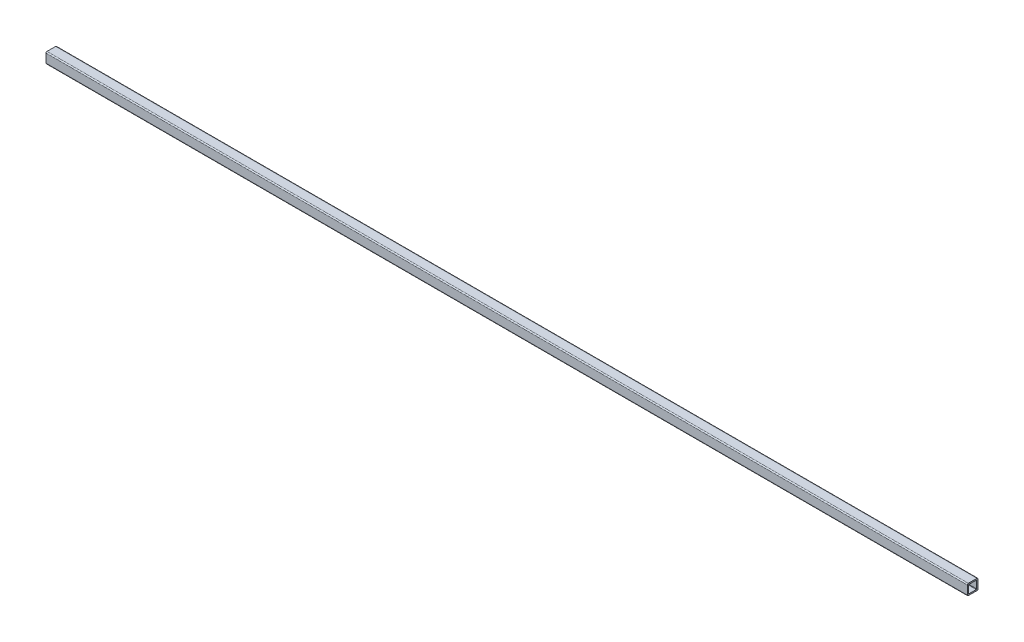
ISO-10303-21;
HEADER;
FILE_DESCRIPTION(('STEP AP214'),'2;1');
FILE_NAME('part.step','',(''),(''),'','','');
FILE_SCHEMA(('AUTOMOTIVE_DESIGN { 1 0 10303 214 1 1 1 1 }'));
ENDSEC;
DATA;
#1=APPLICATION_CONTEXT('core data for automotive mechanical design processes');
#2=APPLICATION_PROTOCOL_DEFINITION('international standard','automotive_design',2000,#1);
#3=PRODUCT_CONTEXT('',#1,'mechanical');
#4=PRODUCT('Part','Part','',(#3));
#5=PRODUCT_RELATED_PRODUCT_CATEGORY('part','',(#4));
#6=PRODUCT_DEFINITION_FORMATION('','',#4);
#7=PRODUCT_DEFINITION_CONTEXT('part definition',#1,'design');
#8=PRODUCT_DEFINITION('design','',#6,#7);
#9=PRODUCT_DEFINITION_SHAPE('','',#8);
#10=(LENGTH_UNIT() NAMED_UNIT(*) SI_UNIT(.MILLI.,.METRE.));
#11=(NAMED_UNIT(*) PLANE_ANGLE_UNIT() SI_UNIT($,.RADIAN.));
#12=(NAMED_UNIT(*) SI_UNIT($,.STERADIAN.) SOLID_ANGLE_UNIT());
#13=UNCERTAINTY_MEASURE_WITH_UNIT(LENGTH_MEASURE(1.E-05),#10,'distance_accuracy_value','');
#14=(GEOMETRIC_REPRESENTATION_CONTEXT(3) GLOBAL_UNCERTAINTY_ASSIGNED_CONTEXT((#13)) GLOBAL_UNIT_ASSIGNED_CONTEXT((#10,
#11,#12)) REPRESENTATION_CONTEXT('',''));
#15=CARTESIAN_POINT('',(0.,0.,0.));
#16=DIRECTION('',(0.,0.,1.));
#17=DIRECTION('',(1.,0.,0.));
#18=AXIS2_PLACEMENT_3D('',#15,#16,#17);
#19=CARTESIAN_POINT('',(-2185.66,12.7,-12.7));
#20=DIRECTION('',(0.,0.,-1.));
#21=DIRECTION('',(0.,1.,0.));
#22=AXIS2_PLACEMENT_3D('',#19,#20,#21);
#23=PLANE('',#22);
#24=DIRECTION('',(0.,1.,0.));
#25=VECTOR('',#24,1.);
#26=CARTESIAN_POINT('',(0.,12.7,-12.7));
#27=LINE('',#26,#25);
#28=CARTESIAN_POINT('',(0.,-10.2,-12.7));
#29=VERTEX_POINT('',#28);
#30=CARTESIAN_POINT('',(0.,10.2,-12.7));
#31=VERTEX_POINT('',#30);
#32=EDGE_CURVE('E258',#29,#31,#27,.T.);
#33=ORIENTED_EDGE('',*,*,#32,.F.);
#34=DIRECTION('',(1.,0.,0.));
#35=VECTOR('',#34,1.);
#36=CARTESIAN_POINT('',(-2185.66,-10.2,-12.7));
#37=LINE('',#36,#35);
#38=CARTESIAN_POINT('',(-2185.66,-10.2,-12.7));
#39=VERTEX_POINT('',#38);
#40=EDGE_CURVE('E187',#29,#39,#37,.F.);
#41=ORIENTED_EDGE('',*,*,#40,.T.);
#42=DIRECTION('',(0.,1.,0.));
#43=VECTOR('',#42,1.);
#44=CARTESIAN_POINT('',(-2185.66,12.7,-12.7));
#45=LINE('',#44,#43);
#46=CARTESIAN_POINT('',(-2185.66,10.2,-12.7));
#47=VERTEX_POINT('',#46);
#48=EDGE_CURVE('E168',#39,#47,#45,.T.);
#49=ORIENTED_EDGE('',*,*,#48,.T.);
#50=DIRECTION('',(1.,0.,0.));
#51=VECTOR('',#50,1.);
#52=CARTESIAN_POINT('',(-2185.66,10.2,-12.7));
#53=LINE('',#52,#51);
#54=EDGE_CURVE('E184',#47,#31,#53,.T.);
#55=ORIENTED_EDGE('',*,*,#54,.T.);
#56=EDGE_LOOP('',(#33,#41,#49,#55));
#57=FACE_BOUND('',#56,.T.);
#58=ADVANCED_FACE('F33',(#57),#23,.T.);
#59=CARTESIAN_POINT('',(-2185.66,-12.7,12.7));
#60=DIRECTION('',(0.,-1.,0.));
#61=DIRECTION('',(0.,0.,-1.));
#62=AXIS2_PLACEMENT_3D('',#59,#60,#61);
#63=PLANE('',#62);
#64=DIRECTION('',(0.,0.,-1.));
#65=VECTOR('',#64,1.);
#66=CARTESIAN_POINT('',(-2185.66,-12.7,12.7));
#67=LINE('',#66,#65);
#68=CARTESIAN_POINT('',(-2185.66,-12.7,10.2));
#69=VERTEX_POINT('',#68);
#70=CARTESIAN_POINT('',(-2185.66,-12.7,-10.2));
#71=VERTEX_POINT('',#70);
#72=EDGE_CURVE('E173',#69,#71,#67,.T.);
#73=ORIENTED_EDGE('',*,*,#72,.T.);
#74=DIRECTION('',(1.,0.,0.));
#75=VECTOR('',#74,1.);
#76=CARTESIAN_POINT('',(-2185.66,-12.7,-10.2));
#77=LINE('',#76,#75);
#78=CARTESIAN_POINT('',(0.,-12.7,-10.2));
#79=VERTEX_POINT('',#78);
#80=EDGE_CURVE('E167',#71,#79,#77,.T.);
#81=ORIENTED_EDGE('',*,*,#80,.T.);
#82=DIRECTION('',(0.,0.,-1.));
#83=VECTOR('',#82,1.);
#84=CARTESIAN_POINT('',(0.,-12.7,12.7));
#85=LINE('',#84,#83);
#86=CARTESIAN_POINT('',(0.,-12.7,10.2));
#87=VERTEX_POINT('',#86);
#88=EDGE_CURVE('E150',#87,#79,#85,.T.);
#89=ORIENTED_EDGE('',*,*,#88,.F.);
#90=DIRECTION('',(1.,0.,0.));
#91=VECTOR('',#90,1.);
#92=CARTESIAN_POINT('',(-2185.66,-12.7,10.2));
#93=LINE('',#92,#91);
#94=EDGE_CURVE('E164',#87,#69,#93,.F.);
#95=ORIENTED_EDGE('',*,*,#94,.T.);
#96=EDGE_LOOP('',(#73,#81,#89,#95));
#97=FACE_BOUND('',#96,.T.);
#98=ADVANCED_FACE('F163',(#97),#63,.T.);
#99=CARTESIAN_POINT('',(-2185.66,12.7,12.7));
#100=DIRECTION('',(0.,0.,1.));
#101=DIRECTION('',(0.,-1.,0.));
#102=AXIS2_PLACEMENT_3D('',#99,#100,#101);
#103=PLANE('',#102);
#104=DIRECTION('',(0.,-1.,0.));
#105=VECTOR('',#104,1.);
#106=CARTESIAN_POINT('',(-2185.66,12.7,12.7));
#107=LINE('',#106,#105);
#108=CARTESIAN_POINT('',(-2185.66,10.2,12.7));
#109=VERTEX_POINT('',#108);
#110=CARTESIAN_POINT('',(-2185.66,-10.2,12.7));
#111=VERTEX_POINT('',#110);
#112=EDGE_CURVE('E177',#109,#111,#107,.T.);
#113=ORIENTED_EDGE('',*,*,#112,.T.);
#114=DIRECTION('',(1.,0.,0.));
#115=VECTOR('',#114,1.);
#116=CARTESIAN_POINT('',(-2185.66,-10.2,12.7));
#117=LINE('',#116,#115);
#118=CARTESIAN_POINT('',(0.,-10.2,12.7));
#119=VERTEX_POINT('',#118);
#120=EDGE_CURVE('E198',#111,#119,#117,.T.);
#121=ORIENTED_EDGE('',*,*,#120,.T.);
#122=DIRECTION('',(0.,-1.,0.));
#123=VECTOR('',#122,1.);
#124=CARTESIAN_POINT('',(0.,12.7,12.7));
#125=LINE('',#124,#123);
#126=CARTESIAN_POINT('',(0.,10.2,12.7));
#127=VERTEX_POINT('',#126);
#128=EDGE_CURVE('E152',#127,#119,#125,.T.);
#129=ORIENTED_EDGE('',*,*,#128,.F.);
#130=DIRECTION('',(1.,0.,0.));
#131=VECTOR('',#130,1.);
#132=CARTESIAN_POINT('',(-2185.66,10.2,12.7));
#133=LINE('',#132,#131);
#134=EDGE_CURVE('E196',#127,#109,#133,.F.);
#135=ORIENTED_EDGE('',*,*,#134,.T.);
#136=EDGE_LOOP('',(#113,#121,#129,#135));
#137=FACE_BOUND('',#136,.T.);
#138=ADVANCED_FACE('F302',(#137),#103,.T.);
#139=CARTESIAN_POINT('',(-2185.66,12.7,12.7));
#140=DIRECTION('',(0.,1.,0.));
#141=DIRECTION('',(0.,0.,1.));
#142=AXIS2_PLACEMENT_3D('',#139,#140,#141);
#143=PLANE('',#142);
#144=DIRECTION('',(0.,0.,1.));
#145=VECTOR('',#144,1.);
#146=CARTESIAN_POINT('',(0.,12.7,12.7));
#147=LINE('',#146,#145);
#148=CARTESIAN_POINT('',(0.,12.7,-10.2));
#149=VERTEX_POINT('',#148);
#150=CARTESIAN_POINT('',(0.,12.7,10.2));
#151=VERTEX_POINT('',#150);
#152=EDGE_CURVE('E261',#149,#151,#147,.T.);
#153=ORIENTED_EDGE('',*,*,#152,.F.);
#154=DIRECTION('',(1.,0.,0.));
#155=VECTOR('',#154,1.);
#156=CARTESIAN_POINT('',(-2185.66,12.7,-10.2));
#157=LINE('',#156,#155);
#158=CARTESIAN_POINT('',(-2185.66,12.7,-10.2));
#159=VERTEX_POINT('',#158);
#160=EDGE_CURVE('E203',#149,#159,#157,.F.);
#161=ORIENTED_EDGE('',*,*,#160,.T.);
#162=DIRECTION('',(0.,0.,1.));
#163=VECTOR('',#162,1.);
#164=CARTESIAN_POINT('',(-2185.66,12.7,12.7));
#165=LINE('',#164,#163);
#166=CARTESIAN_POINT('',(-2185.66,12.7,10.2));
#167=VERTEX_POINT('',#166);
#168=EDGE_CURVE('E276',#159,#167,#165,.T.);
#169=ORIENTED_EDGE('',*,*,#168,.T.);
#170=DIRECTION('',(1.,0.,0.));
#171=VECTOR('',#170,1.);
#172=CARTESIAN_POINT('',(-2185.66,12.7,10.2));
#173=LINE('',#172,#171);
#174=EDGE_CURVE('E200',#167,#151,#173,.T.);
#175=ORIENTED_EDGE('',*,*,#174,.T.);
#176=EDGE_LOOP('',(#153,#161,#169,#175));
#177=FACE_BOUND('',#176,.T.);
#178=ADVANCED_FACE('F285',(#177),#143,.T.);
#179=CARTESIAN_POINT('',(-2185.66,0.,0.));
#180=DIRECTION('',(1.,0.,0.));
#181=DIRECTION('',(0.,0.,-1.));
#182=AXIS2_PLACEMENT_3D('',#179,#180,#181);
#183=PLANE('',#182);
#184=DIRECTION('',(0.,-1.,0.));
#185=VECTOR('',#184,1.);
#186=CARTESIAN_POINT('',(-2185.66,-9.652,9.652));
#187=LINE('',#186,#185);
#188=CARTESIAN_POINT('',(-2185.66,8.652,9.652));
#189=VERTEX_POINT('',#188);
#190=CARTESIAN_POINT('',(-2185.66,-8.652,9.652));
#191=VERTEX_POINT('',#190);
#192=EDGE_CURVE('E254',#189,#191,#187,.T.);
#193=ORIENTED_EDGE('',*,*,#192,.T.);
#194=CARTESIAN_POINT('',(-2185.66,-8.652,8.652));
#195=DIRECTION('',(1.,0.,0.));
#196=DIRECTION('',(0.,0.,-1.));
#197=AXIS2_PLACEMENT_3D('',#194,#195,#196);
#198=CIRCLE('',#197,1.);
#199=CARTESIAN_POINT('',(-2185.66,-9.652,8.652));
#200=VERTEX_POINT('',#199);
#201=EDGE_CURVE('E11',#191,#200,#198,.T.);
#202=ORIENTED_EDGE('',*,*,#201,.T.);
#203=DIRECTION('',(0.,0.,-1.));
#204=VECTOR('',#203,1.);
#205=CARTESIAN_POINT('',(-2185.66,-9.652,9.652));
#206=LINE('',#205,#204);
#207=CARTESIAN_POINT('',(-2185.66,-9.652,-8.652));
#208=VERTEX_POINT('',#207);
#209=EDGE_CURVE('E252',#200,#208,#206,.T.);
#210=ORIENTED_EDGE('',*,*,#209,.T.);
#211=CARTESIAN_POINT('',(-2185.66,-8.652,-8.652));
#212=DIRECTION('',(1.,0.,0.));
#213=DIRECTION('',(0.,0.,-1.));
#214=AXIS2_PLACEMENT_3D('',#211,#212,#213);
#215=CIRCLE('',#214,1.);
#216=CARTESIAN_POINT('',(-2185.66,-8.652,-9.652));
#217=VERTEX_POINT('',#216);
#218=EDGE_CURVE('E226',#208,#217,#215,.T.);
#219=ORIENTED_EDGE('',*,*,#218,.T.);
#220=DIRECTION('',(0.,1.,0.));
#221=VECTOR('',#220,1.);
#222=CARTESIAN_POINT('',(-2185.66,-9.652,-9.652));
#223=LINE('',#222,#221);
#224=CARTESIAN_POINT('',(-2185.66,8.652,-9.652));
#225=VERTEX_POINT('',#224);
#226=EDGE_CURVE('E273',#217,#225,#223,.T.);
#227=ORIENTED_EDGE('',*,*,#226,.T.);
#228=CARTESIAN_POINT('',(-2185.66,8.652,-8.652));
#229=DIRECTION('',(1.,0.,0.));
#230=DIRECTION('',(0.,0.,-1.));
#231=AXIS2_PLACEMENT_3D('',#228,#229,#230);
#232=CIRCLE('',#231,1.);
#233=CARTESIAN_POINT('',(-2185.66,9.652,-8.652));
#234=VERTEX_POINT('',#233);
#235=EDGE_CURVE('E230',#225,#234,#232,.T.);
#236=ORIENTED_EDGE('',*,*,#235,.T.);
#237=DIRECTION('',(0.,0.,1.));
#238=VECTOR('',#237,1.);
#239=CARTESIAN_POINT('',(-2185.66,9.652,9.652));
#240=LINE('',#239,#238);
#241=CARTESIAN_POINT('',(-2185.66,9.652,8.652));
#242=VERTEX_POINT('',#241);
#243=EDGE_CURVE('E263',#234,#242,#240,.T.);
#244=ORIENTED_EDGE('',*,*,#243,.T.);
#245=CARTESIAN_POINT('',(-2185.66,8.652,8.652));
#246=DIRECTION('',(1.,0.,0.));
#247=DIRECTION('',(0.,0.,-1.));
#248=AXIS2_PLACEMENT_3D('',#245,#246,#247);
#249=CIRCLE('',#248,1.);
#250=EDGE_CURVE('E55',#242,#189,#249,.T.);
#251=ORIENTED_EDGE('',*,*,#250,.T.);
#252=EDGE_LOOP('',(#193,#202,#210,#219,#227,#236,#244,#251));
#253=FACE_BOUND('',#252,.T.);
#254=ORIENTED_EDGE('',*,*,#48,.F.);
#255=CARTESIAN_POINT('',(-2185.66,-10.2,-10.2));
#256=DIRECTION('',(1.,0.,0.));
#257=DIRECTION('',(0.,0.,-1.));
#258=AXIS2_PLACEMENT_3D('',#255,#256,#257);
#259=CIRCLE('',#258,2.5);
#260=EDGE_CURVE('E194',#39,#71,#259,.F.);
#261=ORIENTED_EDGE('',*,*,#260,.T.);
#262=ORIENTED_EDGE('',*,*,#72,.F.);
#263=CARTESIAN_POINT('',(-2185.66,-10.2,10.2));
#264=DIRECTION('',(1.,0.,0.));
#265=DIRECTION('',(0.,0.,-1.));
#266=AXIS2_PLACEMENT_3D('',#263,#264,#265);
#267=CIRCLE('',#266,2.5);
#268=EDGE_CURVE('E172',#69,#111,#267,.F.);
#269=ORIENTED_EDGE('',*,*,#268,.T.);
#270=ORIENTED_EDGE('',*,*,#112,.F.);
#271=CARTESIAN_POINT('',(-2185.66,10.2,10.2));
#272=DIRECTION('',(1.,0.,0.));
#273=DIRECTION('',(0.,0.,-1.));
#274=AXIS2_PLACEMENT_3D('',#271,#272,#273);
#275=CIRCLE('',#274,2.5);
#276=EDGE_CURVE('E189',#109,#167,#275,.F.);
#277=ORIENTED_EDGE('',*,*,#276,.T.);
#278=ORIENTED_EDGE('',*,*,#168,.F.);
#279=CARTESIAN_POINT('',(-2185.66,10.2,-10.2));
#280=DIRECTION('',(1.,0.,0.));
#281=DIRECTION('',(0.,0.,-1.));
#282=AXIS2_PLACEMENT_3D('',#279,#280,#281);
#283=CIRCLE('',#282,2.5);
#284=EDGE_CURVE('E191',#159,#47,#283,.F.);
#285=ORIENTED_EDGE('',*,*,#284,.T.);
#286=EDGE_LOOP('',(#254,#261,#262,#269,#270,#277,#278,#285));
#287=FACE_BOUND('',#286,.T.);
#288=ADVANCED_FACE('F250',(#253,#287),#183,.F.);
#289=CARTESIAN_POINT('',(0.,0.,0.));
#290=DIRECTION('',(1.,0.,0.));
#291=DIRECTION('',(0.,0.,-1.));
#292=AXIS2_PLACEMENT_3D('',#289,#290,#291);
#293=PLANE('',#292);
#294=DIRECTION('',(0.,1.,0.));
#295=VECTOR('',#294,1.);
#296=CARTESIAN_POINT('',(0.,-9.652,-9.652));
#297=LINE('',#296,#295);
#298=CARTESIAN_POINT('',(0.,-8.652,-9.652));
#299=VERTEX_POINT('',#298);
#300=CARTESIAN_POINT('',(0.,8.652,-9.652));
#301=VERTEX_POINT('',#300);
#302=EDGE_CURVE('E267',#299,#301,#297,.T.);
#303=ORIENTED_EDGE('',*,*,#302,.F.);
#304=CARTESIAN_POINT('',(0.,-8.652,-8.652));
#305=DIRECTION('',(1.,0.,0.));
#306=DIRECTION('',(0.,0.,-1.));
#307=AXIS2_PLACEMENT_3D('',#304,#305,#306);
#308=CIRCLE('',#307,1.);
#309=CARTESIAN_POINT('',(0.,-9.652,-8.652));
#310=VERTEX_POINT('',#309);
#311=EDGE_CURVE('E224',#299,#310,#308,.F.);
#312=ORIENTED_EDGE('',*,*,#311,.T.);
#313=DIRECTION('',(0.,0.,-1.));
#314=VECTOR('',#313,1.);
#315=CARTESIAN_POINT('',(0.,-9.652,9.652));
#316=LINE('',#315,#314);
#317=CARTESIAN_POINT('',(0.,-9.652,8.652));
#318=VERTEX_POINT('',#317);
#319=EDGE_CURVE('E240',#318,#310,#316,.T.);
#320=ORIENTED_EDGE('',*,*,#319,.F.);
#321=CARTESIAN_POINT('',(0.,-8.652,8.652));
#322=DIRECTION('',(1.,0.,0.));
#323=DIRECTION('',(0.,0.,-1.));
#324=AXIS2_PLACEMENT_3D('',#321,#322,#323);
#325=CIRCLE('',#324,1.);
#326=CARTESIAN_POINT('',(0.,-8.652,9.652));
#327=VERTEX_POINT('',#326);
#328=EDGE_CURVE('E41',#318,#327,#325,.F.);
#329=ORIENTED_EDGE('',*,*,#328,.T.);
#330=DIRECTION('',(0.,-1.,0.));
#331=VECTOR('',#330,1.);
#332=CARTESIAN_POINT('',(0.,-9.652,9.652));
#333=LINE('',#332,#331);
#334=CARTESIAN_POINT('',(0.,8.652,9.652));
#335=VERTEX_POINT('',#334);
#336=EDGE_CURVE('E238',#335,#327,#333,.T.);
#337=ORIENTED_EDGE('',*,*,#336,.F.);
#338=CARTESIAN_POINT('',(0.,8.652,8.652));
#339=DIRECTION('',(1.,0.,0.));
#340=DIRECTION('',(0.,0.,-1.));
#341=AXIS2_PLACEMENT_3D('',#338,#339,#340);
#342=CIRCLE('',#341,1.);
#343=CARTESIAN_POINT('',(0.,9.652,8.652));
#344=VERTEX_POINT('',#343);
#345=EDGE_CURVE('E232',#335,#344,#342,.F.);
#346=ORIENTED_EDGE('',*,*,#345,.T.);
#347=DIRECTION('',(0.,0.,1.));
#348=VECTOR('',#347,1.);
#349=CARTESIAN_POINT('',(0.,9.652,9.652));
#350=LINE('',#349,#348);
#351=CARTESIAN_POINT('',(0.,9.652,-8.652));
#352=VERTEX_POINT('',#351);
#353=EDGE_CURVE('E245',#352,#344,#350,.T.);
#354=ORIENTED_EDGE('',*,*,#353,.F.);
#355=CARTESIAN_POINT('',(0.,8.652,-8.652));
#356=DIRECTION('',(1.,0.,0.));
#357=DIRECTION('',(0.,0.,-1.));
#358=AXIS2_PLACEMENT_3D('',#355,#356,#357);
#359=CIRCLE('',#358,1.);
#360=EDGE_CURVE('E228',#352,#301,#359,.F.);
#361=ORIENTED_EDGE('',*,*,#360,.T.);
#362=EDGE_LOOP('',(#303,#312,#320,#329,#337,#346,#354,#361));
#363=FACE_BOUND('',#362,.T.);
#364=ORIENTED_EDGE('',*,*,#88,.T.);
#365=CARTESIAN_POINT('',(0.,-10.2,-10.2));
#366=DIRECTION('',(1.,0.,0.));
#367=DIRECTION('',(0.,0.,-1.));
#368=AXIS2_PLACEMENT_3D('',#365,#366,#367);
#369=CIRCLE('',#368,2.5);
#370=EDGE_CURVE('E157',#79,#29,#369,.T.);
#371=ORIENTED_EDGE('',*,*,#370,.T.);
#372=ORIENTED_EDGE('',*,*,#32,.T.);
#373=CARTESIAN_POINT('',(0.,10.2,-10.2));
#374=DIRECTION('',(1.,0.,0.));
#375=DIRECTION('',(0.,0.,-1.));
#376=AXIS2_PLACEMENT_3D('',#373,#374,#375);
#377=CIRCLE('',#376,2.5);
#378=EDGE_CURVE('E158',#31,#149,#377,.T.);
#379=ORIENTED_EDGE('',*,*,#378,.T.);
#380=ORIENTED_EDGE('',*,*,#152,.T.);
#381=CARTESIAN_POINT('',(0.,10.2,10.2));
#382=DIRECTION('',(1.,0.,0.));
#383=DIRECTION('',(0.,0.,-1.));
#384=AXIS2_PLACEMENT_3D('',#381,#382,#383);
#385=CIRCLE('',#384,2.5);
#386=EDGE_CURVE('E175',#151,#127,#385,.T.);
#387=ORIENTED_EDGE('',*,*,#386,.T.);
#388=ORIENTED_EDGE('',*,*,#128,.T.);
#389=CARTESIAN_POINT('',(0.,-10.2,10.2));
#390=DIRECTION('',(1.,0.,0.));
#391=DIRECTION('',(0.,0.,-1.));
#392=AXIS2_PLACEMENT_3D('',#389,#390,#391);
#393=CIRCLE('',#392,2.5);
#394=EDGE_CURVE('E147',#119,#87,#393,.T.);
#395=ORIENTED_EDGE('',*,*,#394,.T.);
#396=EDGE_LOOP('',(#364,#371,#372,#379,#380,#387,#388,#395));
#397=FACE_BOUND('',#396,.T.);
#398=ADVANCED_FACE('F149',(#363,#397),#293,.T.);
#399=CARTESIAN_POINT('',(-2185.66,-9.652,-9.652));
#400=DIRECTION('',(0.,0.,-1.));
#401=DIRECTION('',(-1.,0.,0.));
#402=AXIS2_PLACEMENT_3D('',#399,#400,#401);
#403=PLANE('',#402);
#404=ORIENTED_EDGE('',*,*,#226,.F.);
#405=DIRECTION('',(1.,0.,0.));
#406=VECTOR('',#405,1.);
#407=CARTESIAN_POINT('',(0.,-8.652,-9.652));
#408=LINE('',#407,#406);
#409=EDGE_CURVE('E207',#217,#299,#408,.T.);
#410=ORIENTED_EDGE('',*,*,#409,.T.);
#411=ORIENTED_EDGE('',*,*,#302,.T.);
#412=DIRECTION('',(1.,0.,0.));
#413=VECTOR('',#412,1.);
#414=CARTESIAN_POINT('',(-2185.66,8.652,-9.652));
#415=LINE('',#414,#413);
#416=EDGE_CURVE('E205',#301,#225,#415,.F.);
#417=ORIENTED_EDGE('',*,*,#416,.T.);
#418=EDGE_LOOP('',(#404,#410,#411,#417));
#419=FACE_BOUND('',#418,.T.);
#420=ADVANCED_FACE('F363',(#419),#403,.F.);
#421=CARTESIAN_POINT('',(-2185.66,-9.652,9.652));
#422=DIRECTION('',(0.,-1.,0.));
#423=DIRECTION('',(0.,0.,-1.));
#424=AXIS2_PLACEMENT_3D('',#421,#422,#423);
#425=PLANE('',#424);
#426=ORIENTED_EDGE('',*,*,#319,.T.);
#427=DIRECTION('',(1.,0.,0.));
#428=VECTOR('',#427,1.);
#429=CARTESIAN_POINT('',(-2185.66,-9.652,-8.652));
#430=LINE('',#429,#428);
#431=EDGE_CURVE('E213',#310,#208,#430,.F.);
#432=ORIENTED_EDGE('',*,*,#431,.T.);
#433=ORIENTED_EDGE('',*,*,#209,.F.);
#434=DIRECTION('',(1.,0.,0.));
#435=VECTOR('',#434,1.);
#436=CARTESIAN_POINT('',(0.,-9.652,8.652));
#437=LINE('',#436,#435);
#438=EDGE_CURVE('E210',#200,#318,#437,.T.);
#439=ORIENTED_EDGE('',*,*,#438,.T.);
#440=EDGE_LOOP('',(#426,#432,#433,#439));
#441=FACE_BOUND('',#440,.T.);
#442=ADVANCED_FACE('F256',(#441),#425,.F.);
#443=CARTESIAN_POINT('',(-2185.66,-9.652,9.652));
#444=DIRECTION('',(0.,0.,1.));
#445=DIRECTION('',(1.,0.,0.));
#446=AXIS2_PLACEMENT_3D('',#443,#444,#445);
#447=PLANE('',#446);
#448=ORIENTED_EDGE('',*,*,#192,.F.);
#449=DIRECTION('',(1.,0.,0.));
#450=VECTOR('',#449,1.);
#451=CARTESIAN_POINT('',(0.,8.652,9.652));
#452=LINE('',#451,#450);
#453=EDGE_CURVE('E221',#189,#335,#452,.T.);
#454=ORIENTED_EDGE('',*,*,#453,.T.);
#455=ORIENTED_EDGE('',*,*,#336,.T.);
#456=DIRECTION('',(1.,0.,0.));
#457=VECTOR('',#456,1.);
#458=CARTESIAN_POINT('',(-2185.66,-8.652,9.652));
#459=LINE('',#458,#457);
#460=EDGE_CURVE('E48',#327,#191,#459,.F.);
#461=ORIENTED_EDGE('',*,*,#460,.T.);
#462=EDGE_LOOP('',(#448,#454,#455,#461));
#463=FACE_BOUND('',#462,.T.);
#464=ADVANCED_FACE('F243',(#463),#447,.F.);
#465=CARTESIAN_POINT('',(-2185.66,9.652,9.652));
#466=DIRECTION('',(0.,1.,0.));
#467=DIRECTION('',(0.,0.,1.));
#468=AXIS2_PLACEMENT_3D('',#465,#466,#467);
#469=PLANE('',#468);
#470=ORIENTED_EDGE('',*,*,#243,.F.);
#471=DIRECTION('',(1.,0.,0.));
#472=VECTOR('',#471,1.);
#473=CARTESIAN_POINT('',(0.,9.652,-8.652));
#474=LINE('',#473,#472);
#475=EDGE_CURVE('E217',#234,#352,#474,.T.);
#476=ORIENTED_EDGE('',*,*,#475,.T.);
#477=ORIENTED_EDGE('',*,*,#353,.T.);
#478=DIRECTION('',(1.,0.,0.));
#479=VECTOR('',#478,1.);
#480=CARTESIAN_POINT('',(-2185.66,9.652,8.652));
#481=LINE('',#480,#479);
#482=EDGE_CURVE('E215',#344,#242,#481,.F.);
#483=ORIENTED_EDGE('',*,*,#482,.T.);
#484=EDGE_LOOP('',(#470,#476,#477,#483));
#485=FACE_BOUND('',#484,.T.);
#486=ADVANCED_FACE('F328',(#485),#469,.F.);
#487=CARTESIAN_POINT('',(-2185.66,-10.2,-10.2));
#488=DIRECTION('',(1.,0.,0.));
#489=DIRECTION('',(0.,0.,-1.));
#490=AXIS2_PLACEMENT_3D('',#487,#488,#489);
#491=CYLINDRICAL_SURFACE('',#490,2.5);
#492=ORIENTED_EDGE('',*,*,#260,.F.);
#493=ORIENTED_EDGE('',*,*,#40,.F.);
#494=ORIENTED_EDGE('',*,*,#370,.F.);
#495=ORIENTED_EDGE('',*,*,#80,.F.);
#496=EDGE_LOOP('',(#492,#493,#494,#495));
#497=FACE_BOUND('',#496,.T.);
#498=ADVANCED_FACE('F298',(#497),#491,.T.);
#499=CARTESIAN_POINT('',(-2185.66,-10.2,10.2));
#500=DIRECTION('',(1.,0.,0.));
#501=DIRECTION('',(0.,0.,-1.));
#502=AXIS2_PLACEMENT_3D('',#499,#500,#501);
#503=CYLINDRICAL_SURFACE('',#502,2.5);
#504=ORIENTED_EDGE('',*,*,#268,.F.);
#505=ORIENTED_EDGE('',*,*,#94,.F.);
#506=ORIENTED_EDGE('',*,*,#394,.F.);
#507=ORIENTED_EDGE('',*,*,#120,.F.);
#508=EDGE_LOOP('',(#504,#505,#506,#507));
#509=FACE_BOUND('',#508,.T.);
#510=ADVANCED_FACE('F171',(#509),#503,.T.);
#511=CARTESIAN_POINT('',(-2185.66,10.2,-10.2));
#512=DIRECTION('',(1.,0.,0.));
#513=DIRECTION('',(0.,0.,-1.));
#514=AXIS2_PLACEMENT_3D('',#511,#512,#513);
#515=CYLINDRICAL_SURFACE('',#514,2.5);
#516=ORIENTED_EDGE('',*,*,#284,.F.);
#517=ORIENTED_EDGE('',*,*,#160,.F.);
#518=ORIENTED_EDGE('',*,*,#378,.F.);
#519=ORIENTED_EDGE('',*,*,#54,.F.);
#520=EDGE_LOOP('',(#516,#517,#518,#519));
#521=FACE_BOUND('',#520,.T.);
#522=ADVANCED_FACE('F290',(#521),#515,.T.);
#523=CARTESIAN_POINT('',(-2185.66,10.2,10.2));
#524=DIRECTION('',(1.,0.,0.));
#525=DIRECTION('',(0.,0.,-1.));
#526=AXIS2_PLACEMENT_3D('',#523,#524,#525);
#527=CYLINDRICAL_SURFACE('',#526,2.5);
#528=ORIENTED_EDGE('',*,*,#276,.F.);
#529=ORIENTED_EDGE('',*,*,#134,.F.);
#530=ORIENTED_EDGE('',*,*,#386,.F.);
#531=ORIENTED_EDGE('',*,*,#174,.F.);
#532=EDGE_LOOP('',(#528,#529,#530,#531));
#533=FACE_BOUND('',#532,.T.);
#534=ADVANCED_FACE('F305',(#533),#527,.T.);
#535=CARTESIAN_POINT('',(-2185.66,-8.652,-8.652));
#536=DIRECTION('',(-1.,0.,0.));
#537=DIRECTION('',(0.,0.,1.));
#538=AXIS2_PLACEMENT_3D('',#535,#536,#537);
#539=CYLINDRICAL_SURFACE('',#538,1.);
#540=ORIENTED_EDGE('',*,*,#218,.F.);
#541=ORIENTED_EDGE('',*,*,#431,.F.);
#542=ORIENTED_EDGE('',*,*,#311,.F.);
#543=ORIENTED_EDGE('',*,*,#409,.F.);
#544=EDGE_LOOP('',(#540,#541,#542,#543));
#545=FACE_BOUND('',#544,.T.);
#546=ADVANCED_FACE('F307',(#545),#539,.F.);
#547=CARTESIAN_POINT('',(-2185.66,8.652,-8.652));
#548=DIRECTION('',(-1.,0.,0.));
#549=DIRECTION('',(0.,0.,1.));
#550=AXIS2_PLACEMENT_3D('',#547,#548,#549);
#551=CYLINDRICAL_SURFACE('',#550,1.);
#552=ORIENTED_EDGE('',*,*,#235,.F.);
#553=ORIENTED_EDGE('',*,*,#416,.F.);
#554=ORIENTED_EDGE('',*,*,#360,.F.);
#555=ORIENTED_EDGE('',*,*,#475,.F.);
#556=EDGE_LOOP('',(#552,#553,#554,#555));
#557=FACE_BOUND('',#556,.T.);
#558=ADVANCED_FACE('F313',(#557),#551,.F.);
#559=CARTESIAN_POINT('',(-2185.66,8.652,8.652));
#560=DIRECTION('',(-1.,0.,0.));
#561=DIRECTION('',(0.,0.,1.));
#562=AXIS2_PLACEMENT_3D('',#559,#560,#561);
#563=CYLINDRICAL_SURFACE('',#562,1.);
#564=ORIENTED_EDGE('',*,*,#250,.F.);
#565=ORIENTED_EDGE('',*,*,#482,.F.);
#566=ORIENTED_EDGE('',*,*,#345,.F.);
#567=ORIENTED_EDGE('',*,*,#453,.F.);
#568=EDGE_LOOP('',(#564,#565,#566,#567));
#569=FACE_BOUND('',#568,.T.);
#570=ADVANCED_FACE('F411',(#569),#563,.F.);
#571=CARTESIAN_POINT('',(-2185.66,-8.652,8.652));
#572=DIRECTION('',(-1.,0.,0.));
#573=DIRECTION('',(0.,0.,1.));
#574=AXIS2_PLACEMENT_3D('',#571,#572,#573);
#575=CYLINDRICAL_SURFACE('',#574,1.);
#576=ORIENTED_EDGE('',*,*,#201,.F.);
#577=ORIENTED_EDGE('',*,*,#460,.F.);
#578=ORIENTED_EDGE('',*,*,#328,.F.);
#579=ORIENTED_EDGE('',*,*,#438,.F.);
#580=EDGE_LOOP('',(#576,#577,#578,#579));
#581=FACE_BOUND('',#580,.T.);
#582=ADVANCED_FACE('F35',(#581),#575,.F.);
#583=CLOSED_SHELL('',(#58,#98,#138,#178,#288,#398,#420,#442,#464,#486,#498,#510,#522,#534,#546,
#558,#570,#582));
#584=MANIFOLD_SOLID_BREP('B2',#583);
#585=ADVANCED_BREP_SHAPE_REPRESENTATION('',(#18,#584),#14);
#586=SHAPE_DEFINITION_REPRESENTATION(#9,#585);
ENDSEC;
END-ISO-10303-21;
